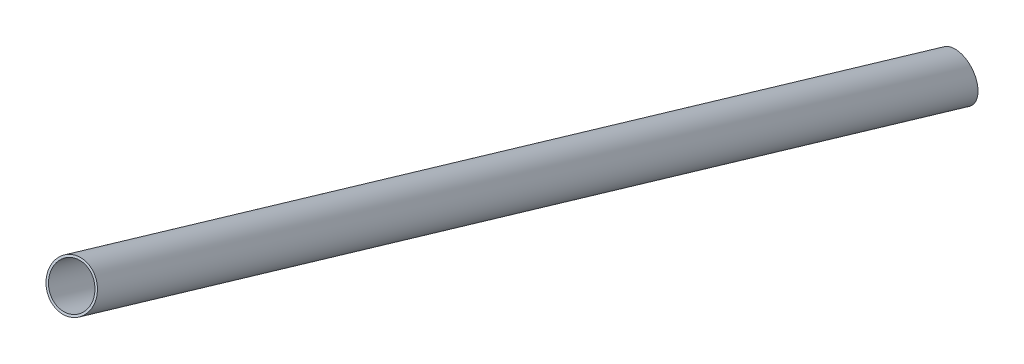
ISO-10303-21;
HEADER;
FILE_DESCRIPTION(('STEP AP214'),'2;1');
FILE_NAME('part.step','',(''),(''),'','','');
FILE_SCHEMA(('AUTOMOTIVE_DESIGN { 1 0 10303 214 1 1 1 1 }'));
ENDSEC;
DATA;
#1=APPLICATION_CONTEXT('core data for automotive mechanical design processes');
#2=APPLICATION_PROTOCOL_DEFINITION('international standard','automotive_design',2000,#1);
#3=PRODUCT_CONTEXT('',#1,'mechanical');
#4=PRODUCT('Part','Part','',(#3));
#5=PRODUCT_RELATED_PRODUCT_CATEGORY('part','',(#4));
#6=PRODUCT_DEFINITION_FORMATION('','',#4);
#7=PRODUCT_DEFINITION_CONTEXT('part definition',#1,'design');
#8=PRODUCT_DEFINITION('design','',#6,#7);
#9=PRODUCT_DEFINITION_SHAPE('','',#8);
#10=(LENGTH_UNIT() NAMED_UNIT(*) SI_UNIT(.MILLI.,.METRE.));
#11=(NAMED_UNIT(*) PLANE_ANGLE_UNIT() SI_UNIT($,.RADIAN.));
#12=(NAMED_UNIT(*) SI_UNIT($,.STERADIAN.) SOLID_ANGLE_UNIT());
#13=UNCERTAINTY_MEASURE_WITH_UNIT(LENGTH_MEASURE(1.E-05),#10,'distance_accuracy_value','');
#14=(GEOMETRIC_REPRESENTATION_CONTEXT(3) GLOBAL_UNCERTAINTY_ASSIGNED_CONTEXT((#13)) GLOBAL_UNIT_ASSIGNED_CONTEXT((#10,
#11,#12)) REPRESENTATION_CONTEXT('',''));
#15=CARTESIAN_POINT('',(0.,0.,0.));
#16=DIRECTION('',(0.,0.,1.));
#17=DIRECTION('',(1.,0.,0.));
#18=AXIS2_PLACEMENT_3D('',#15,#16,#17);
#19=CARTESIAN_POINT('',(225.,200.,-450.));
#20=DIRECTION('',(-0.0952883546426035,-0.34294009382942,-0.934511755685167));
#21=DIRECTION('',(0.,0.938783490773443,-0.344507703036127));
#22=AXIS2_PLACEMENT_3D('',#19,#20,#21);
#23=CYLINDRICAL_SURFACE('',#22,11.3);
#24=CARTESIAN_POINT('',(225.,200.,-450.));
#25=DIRECTION('',(0.0952883546426035,0.34294009382942,0.934511755685168));
#26=DIRECTION('',(-0.0456648186045329,-0.936289272975767,0.348248649175161));
#27=AXIS2_PLACEMENT_3D('',#24,#25,#26);
#28=CIRCLE('',#27,11.3);
#29=CARTESIAN_POINT('',(224.483987549769,189.419931215374,-446.064790264321));
#30=VERTEX_POINT('',#29);
#31=EDGE_CURVE('E53',#30,#30,#28,.T.);
#32=ORIENTED_EDGE('',*,*,#31,.T.);
#33=EDGE_LOOP('',(#32));
#34=FACE_BOUND('',#33,.T.);
#35=CARTESIAN_POINT('',(169.428571428571,-1.38777878078145E-13,-994.999999999999));
#36=DIRECTION('',(0.0733678743643172,0.0691920948731021,-0.994901808732064));
#37=DIRECTION('',(-0.368237148377429,-0.925218330098196,-0.0915010612242575));
#38=AXIS2_PLACEMENT_3D('',#35,#36,#37);
#39=ELLIPSE('',#38,12.5691359696722,11.3);
#40=CARTESIAN_POINT('',(164.800148641531,-11.6291949926374,-996.150089279896));
#41=VERTEX_POINT('',#40);
#42=EDGE_CURVE('E43',#41,#41,#39,.T.);
#43=ORIENTED_EDGE('',*,*,#42,.T.);
#44=EDGE_LOOP('',(#43));
#45=FACE_BOUND('',#44,.T.);
#46=ADVANCED_FACE('F39',(#34,#45),#23,.F.);
#47=CARTESIAN_POINT('',(225.,200.,-450.));
#48=DIRECTION('',(-0.0952883546426035,-0.34294009382942,-0.934511755685167));
#49=DIRECTION('',(0.,0.938783490773443,-0.344507703036127));
#50=AXIS2_PLACEMENT_3D('',#47,#48,#49);
#51=CYLINDRICAL_SURFACE('',#50,12.5);
#52=CARTESIAN_POINT('',(225.,200.,-450.));
#53=DIRECTION('',(0.0952883546426035,0.34294009382942,0.934511755685168));
#54=DIRECTION('',(-0.0456648186045329,-0.936289272975767,0.348248649175161));
#55=AXIS2_PLACEMENT_3D('',#52,#53,#54);
#56=CIRCLE('',#55,12.5);
#57=CARTESIAN_POINT('',(224.429189767443,188.296384087803,-445.646891885311));
#58=VERTEX_POINT('',#57);
#59=EDGE_CURVE('E47',#58,#58,#56,.T.);
#60=ORIENTED_EDGE('',*,*,#59,.F.);
#61=EDGE_LOOP('',(#60));
#62=FACE_BOUND('',#61,.T.);
#63=CARTESIAN_POINT('',(169.428571428571,-1.38777878078145E-13,-994.999999999999));
#64=DIRECTION('',(0.0733678743643172,0.0691920948731021,-0.994901808732064));
#65=DIRECTION('',(-0.368237148377429,-0.925218330098196,-0.0915010612242575));
#66=AXIS2_PLACEMENT_3D('',#63,#64,#65);
#67=ELLIPSE('',#66,13.9039114708763,12.5);
#68=CARTESIAN_POINT('',(164.308634717244,-12.8641537529175,-996.272222654753));
#69=VERTEX_POINT('',#68);
#70=EDGE_CURVE('E10',#69,#69,#67,.T.);
#71=ORIENTED_EDGE('',*,*,#70,.F.);
#72=EDGE_LOOP('',(#71));
#73=FACE_BOUND('',#72,.T.);
#74=ADVANCED_FACE('F67',(#62,#73),#51,.T.);
#75=CARTESIAN_POINT('',(225.,200.,-450.));
#76=DIRECTION('',(0.0952883546426035,0.34294009382942,0.934511755685168));
#77=DIRECTION('',(-0.0456648186045329,-0.936289272975767,0.348248649175161));
#78=AXIS2_PLACEMENT_3D('',#75,#76,#77);
#79=PLANE('',#78);
#80=ORIENTED_EDGE('',*,*,#31,.F.);
#81=EDGE_LOOP('',(#80));
#82=FACE_BOUND('',#81,.T.);
#83=ORIENTED_EDGE('',*,*,#59,.T.);
#84=EDGE_LOOP('',(#83));
#85=FACE_BOUND('',#84,.T.);
#86=ADVANCED_FACE('F62',(#82,#85),#79,.T.);
#87=CARTESIAN_POINT('',(169.428571428571,0.,-994.999999999999));
#88=DIRECTION('',(0.0733678743643172,0.0691920948731021,-0.994901808732064));
#89=DIRECTION('',(-0.997291963479987,0.,-0.0735441335405673));
#90=AXIS2_PLACEMENT_3D('',#87,#88,#89);
#91=PLANE('',#90);
#92=ORIENTED_EDGE('',*,*,#42,.F.);
#93=EDGE_LOOP('',(#92));
#94=FACE_BOUND('',#93,.T.);
#95=ORIENTED_EDGE('',*,*,#70,.T.);
#96=EDGE_LOOP('',(#95));
#97=FACE_BOUND('',#96,.T.);
#98=ADVANCED_FACE('F41',(#94,#97),#91,.T.);
#99=CLOSED_SHELL('',(#46,#74,#86,#98));
#100=MANIFOLD_SOLID_BREP('B2',#99);
#101=ADVANCED_BREP_SHAPE_REPRESENTATION('',(#18,#100),#14);
#102=SHAPE_DEFINITION_REPRESENTATION(#9,#101);
ENDSEC;
END-ISO-10303-21;
